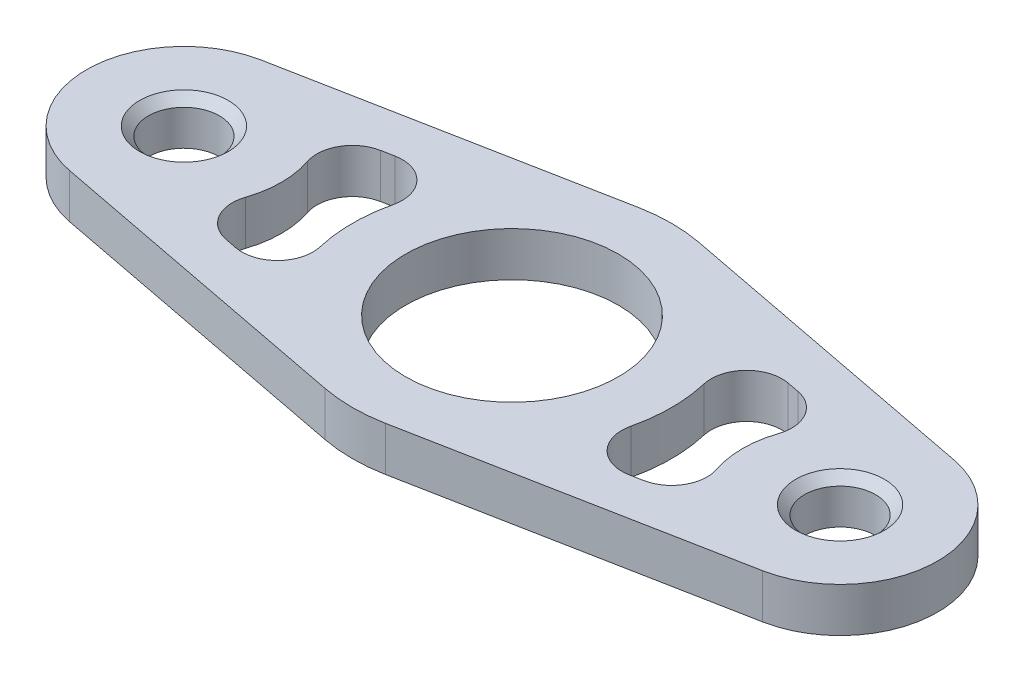
ISO-10303-21;
HEADER;
FILE_DESCRIPTION(('STEP AP214'),'2;1');
FILE_NAME('part.step','',(''),(''),'','','');
FILE_SCHEMA(('AUTOMOTIVE_DESIGN { 1 0 10303 214 1 1 1 1 }'));
ENDSEC;
DATA;
#1=APPLICATION_CONTEXT('core data for automotive mechanical design processes');
#2=APPLICATION_PROTOCOL_DEFINITION('international standard','automotive_design',2000,#1);
#3=PRODUCT_CONTEXT('',#1,'mechanical');
#4=PRODUCT('Part','Part','',(#3));
#5=PRODUCT_RELATED_PRODUCT_CATEGORY('part','',(#4));
#6=PRODUCT_DEFINITION_FORMATION('','',#4);
#7=PRODUCT_DEFINITION_CONTEXT('part definition',#1,'design');
#8=PRODUCT_DEFINITION('design','',#6,#7);
#9=PRODUCT_DEFINITION_SHAPE('','',#8);
#10=(LENGTH_UNIT() NAMED_UNIT(*) SI_UNIT(.MILLI.,.METRE.));
#11=(NAMED_UNIT(*) PLANE_ANGLE_UNIT() SI_UNIT($,.RADIAN.));
#12=(NAMED_UNIT(*) SI_UNIT($,.STERADIAN.) SOLID_ANGLE_UNIT());
#13=UNCERTAINTY_MEASURE_WITH_UNIT(LENGTH_MEASURE(1.E-05),#10,'distance_accuracy_value','');
#14=(GEOMETRIC_REPRESENTATION_CONTEXT(3) GLOBAL_UNCERTAINTY_ASSIGNED_CONTEXT((#13)) GLOBAL_UNIT_ASSIGNED_CONTEXT((#10,
#11,#12)) REPRESENTATION_CONTEXT('',''));
#15=CARTESIAN_POINT('',(0.,0.,0.));
#16=DIRECTION('',(0.,0.,1.));
#17=DIRECTION('',(1.,0.,0.));
#18=AXIS2_PLACEMENT_3D('',#15,#16,#17);
#19=CARTESIAN_POINT('',(3.40540540540541,2.5,-17.6749317968935));
#20=DIRECTION('',(-0.189189189189189,0.,0.98194065538297));
#21=DIRECTION('',(0.98194065538297,0.,0.189189189189189));
#22=AXIS2_PLACEMENT_3D('',#19,#20,#21);
#23=PLANE('',#22);
#24=DIRECTION('',(-0.98194065538297,0.,-0.189189189189189));
#25=VECTOR('',#24,1.);
#26=CARTESIAN_POINT('',(3.40540540540541,-2.5,-17.6749317968935));
#27=LINE('',#26,#25);
#28=CARTESIAN_POINT('',(39.0810810810811,-2.5,-10.8013472092127));
#29=VERTEX_POINT('',#28);
#30=CARTESIAN_POINT('',(3.40540540540541,-2.5,-17.6749317968935));
#31=VERTEX_POINT('',#30);
#32=EDGE_CURVE('E234',#29,#31,#27,.T.);
#33=ORIENTED_EDGE('',*,*,#32,.T.);
#34=DIRECTION('',(0.,-1.,0.));
#35=VECTOR('',#34,1.);
#36=CARTESIAN_POINT('',(3.40540540540541,2.5,-17.6749317968935));
#37=LINE('',#36,#35);
#38=CARTESIAN_POINT('',(3.40540540540541,2.5,-17.6749317968935));
#39=VERTEX_POINT('',#38);
#40=EDGE_CURVE('E213',#39,#31,#37,.T.);
#41=ORIENTED_EDGE('',*,*,#40,.F.);
#42=DIRECTION('',(-0.98194065538297,0.,-0.189189189189189));
#43=VECTOR('',#42,1.);
#44=CARTESIAN_POINT('',(3.40540540540541,2.5,-17.6749317968935));
#45=LINE('',#44,#43);
#46=CARTESIAN_POINT('',(39.0810810810811,2.5,-10.8013472092127));
#47=VERTEX_POINT('',#46);
#48=EDGE_CURVE('E221',#47,#39,#45,.T.);
#49=ORIENTED_EDGE('',*,*,#48,.F.);
#50=DIRECTION('',(0.,-1.,0.));
#51=VECTOR('',#50,1.);
#52=CARTESIAN_POINT('',(39.0810810810811,2.5,-10.8013472092127));
#53=LINE('',#52,#51);
#54=EDGE_CURVE('E448',#47,#29,#53,.T.);
#55=ORIENTED_EDGE('',*,*,#54,.T.);
#56=EDGE_LOOP('',(#33,#41,#49,#55));
#57=FACE_BOUND('',#56,.T.);
#58=ADVANCED_FACE('F43',(#57),#23,.F.);
#59=CARTESIAN_POINT('',(0.,2.5,0.));
#60=DIRECTION('',(0.,-1.,0.));
#61=DIRECTION('',(0.,0.,-1.));
#62=AXIS2_PLACEMENT_3D('',#59,#60,#61);
#63=CYLINDRICAL_SURFACE('',#62,18.);
#64=CARTESIAN_POINT('',(0.,-2.5,0.));
#65=DIRECTION('',(0.,1.,0.));
#66=DIRECTION('',(0.,0.,1.));
#67=AXIS2_PLACEMENT_3D('',#64,#65,#66);
#68=CIRCLE('',#67,18.);
#69=CARTESIAN_POINT('',(-3.40540540540541,-2.5,-17.6749317968935));
#70=VERTEX_POINT('',#69);
#71=EDGE_CURVE('E423',#31,#70,#68,.T.);
#72=ORIENTED_EDGE('',*,*,#71,.T.);
#73=DIRECTION('',(0.,-1.,0.));
#74=VECTOR('',#73,1.);
#75=CARTESIAN_POINT('',(-3.40540540540541,2.5,-17.6749317968935));
#76=LINE('',#75,#74);
#77=CARTESIAN_POINT('',(-3.40540540540541,2.5,-17.6749317968935));
#78=VERTEX_POINT('',#77);
#79=EDGE_CURVE('E215',#78,#70,#76,.T.);
#80=ORIENTED_EDGE('',*,*,#79,.F.);
#81=CARTESIAN_POINT('',(0.,2.5,0.));
#82=DIRECTION('',(0.,1.,0.));
#83=DIRECTION('',(0.,0.,1.));
#84=AXIS2_PLACEMENT_3D('',#81,#82,#83);
#85=CIRCLE('',#84,18.);
#86=EDGE_CURVE('E208',#39,#78,#85,.T.);
#87=ORIENTED_EDGE('',*,*,#86,.F.);
#88=ORIENTED_EDGE('',*,*,#40,.T.);
#89=EDGE_LOOP('',(#72,#80,#87,#88));
#90=FACE_BOUND('',#89,.T.);
#91=ADVANCED_FACE('F211',(#90),#63,.T.);
#92=CARTESIAN_POINT('',(-3.40540540540541,2.5,-17.6749317968935));
#93=DIRECTION('',(-0.189189189189189,0.,-0.98194065538297));
#94=DIRECTION('',(-0.98194065538297,0.,0.189189189189189));
#95=AXIS2_PLACEMENT_3D('',#92,#93,#94);
#96=PLANE('',#95);
#97=DIRECTION('',(0.98194065538297,0.,-0.189189189189189));
#98=VECTOR('',#97,1.);
#99=CARTESIAN_POINT('',(-3.40540540540541,-2.5,-17.6749317968935));
#100=LINE('',#99,#98);
#101=CARTESIAN_POINT('',(-39.0810810810811,-2.5,-10.8013472092127));
#102=VERTEX_POINT('',#101);
#103=EDGE_CURVE('E426',#102,#70,#100,.T.);
#104=ORIENTED_EDGE('',*,*,#103,.F.);
#105=DIRECTION('',(0.,-1.,0.));
#106=VECTOR('',#105,1.);
#107=CARTESIAN_POINT('',(-39.0810810810811,2.5,-10.8013472092127));
#108=LINE('',#107,#106);
#109=CARTESIAN_POINT('',(-39.0810810810811,2.5,-10.8013472092127));
#110=VERTEX_POINT('',#109);
#111=EDGE_CURVE('E242',#110,#102,#108,.T.);
#112=ORIENTED_EDGE('',*,*,#111,.F.);
#113=DIRECTION('',(0.98194065538297,0.,-0.189189189189189));
#114=VECTOR('',#113,1.);
#115=CARTESIAN_POINT('',(-3.40540540540541,2.5,-17.6749317968935));
#116=LINE('',#115,#114);
#117=EDGE_CURVE('E220',#110,#78,#116,.T.);
#118=ORIENTED_EDGE('',*,*,#117,.T.);
#119=ORIENTED_EDGE('',*,*,#79,.T.);
#120=EDGE_LOOP('',(#104,#112,#118,#119));
#121=FACE_BOUND('',#120,.T.);
#122=ADVANCED_FACE('F475',(#121),#96,.T.);
#123=CARTESIAN_POINT('',(-37.,2.5,0.));
#124=DIRECTION('',(0.,-1.,0.));
#125=DIRECTION('',(0.,0.,-1.));
#126=AXIS2_PLACEMENT_3D('',#123,#124,#125);
#127=CYLINDRICAL_SURFACE('',#126,11.);
#128=CARTESIAN_POINT('',(-37.,-2.5,0.));
#129=DIRECTION('',(0.,1.,0.));
#130=DIRECTION('',(0.,0.,1.));
#131=AXIS2_PLACEMENT_3D('',#128,#129,#130);
#132=CIRCLE('',#131,11.);
#133=CARTESIAN_POINT('',(-39.0810810810811,-2.5,10.8013472092127));
#134=VERTEX_POINT('',#133);
#135=EDGE_CURVE('E430',#102,#134,#132,.T.);
#136=ORIENTED_EDGE('',*,*,#135,.T.);
#137=DIRECTION('',(0.,-1.,0.));
#138=VECTOR('',#137,1.);
#139=CARTESIAN_POINT('',(-39.0810810810811,2.5,10.8013472092127));
#140=LINE('',#139,#138);
#141=CARTESIAN_POINT('',(-39.0810810810811,2.5,10.8013472092127));
#142=VERTEX_POINT('',#141);
#143=EDGE_CURVE('E461',#142,#134,#140,.T.);
#144=ORIENTED_EDGE('',*,*,#143,.F.);
#145=CARTESIAN_POINT('',(-37.,2.5,0.));
#146=DIRECTION('',(0.,1.,0.));
#147=DIRECTION('',(0.,0.,1.));
#148=AXIS2_PLACEMENT_3D('',#145,#146,#147);
#149=CIRCLE('',#148,11.);
#150=EDGE_CURVE('E470',#110,#142,#149,.T.);
#151=ORIENTED_EDGE('',*,*,#150,.F.);
#152=ORIENTED_EDGE('',*,*,#111,.T.);
#153=EDGE_LOOP('',(#136,#144,#151,#152));
#154=FACE_BOUND('',#153,.T.);
#155=ADVANCED_FACE('F468',(#154),#127,.T.);
#156=CARTESIAN_POINT('',(-3.4054054054054,2.5,17.6749317968935));
#157=DIRECTION('',(0.189189189189189,0.,-0.98194065538297));
#158=DIRECTION('',(-0.98194065538297,0.,-0.189189189189189));
#159=AXIS2_PLACEMENT_3D('',#156,#157,#158);
#160=PLANE('',#159);
#161=DIRECTION('',(0.98194065538297,0.,0.189189189189189));
#162=VECTOR('',#161,1.);
#163=CARTESIAN_POINT('',(-3.4054054054054,-2.5,17.6749317968935));
#164=LINE('',#163,#162);
#165=CARTESIAN_POINT('',(-3.4054054054054,-2.5,17.6749317968935));
#166=VERTEX_POINT('',#165);
#167=EDGE_CURVE('E433',#134,#166,#164,.T.);
#168=ORIENTED_EDGE('',*,*,#167,.T.);
#169=DIRECTION('',(0.,-1.,0.));
#170=VECTOR('',#169,1.);
#171=CARTESIAN_POINT('',(-3.4054054054054,2.5,17.6749317968935));
#172=LINE('',#171,#170);
#173=CARTESIAN_POINT('',(-3.4054054054054,2.5,17.6749317968935));
#174=VERTEX_POINT('',#173);
#175=EDGE_CURVE('E457',#174,#166,#172,.T.);
#176=ORIENTED_EDGE('',*,*,#175,.F.);
#177=DIRECTION('',(0.98194065538297,0.,0.189189189189189));
#178=VECTOR('',#177,1.);
#179=CARTESIAN_POINT('',(-3.4054054054054,2.5,17.6749317968935));
#180=LINE('',#179,#178);
#181=EDGE_CURVE('E491',#142,#174,#180,.T.);
#182=ORIENTED_EDGE('',*,*,#181,.F.);
#183=ORIENTED_EDGE('',*,*,#143,.T.);
#184=EDGE_LOOP('',(#168,#176,#182,#183));
#185=FACE_BOUND('',#184,.T.);
#186=ADVANCED_FACE('F490',(#185),#160,.F.);
#187=CARTESIAN_POINT('',(0.,2.5,0.));
#188=DIRECTION('',(0.,-1.,0.));
#189=DIRECTION('',(0.,0.,-1.));
#190=AXIS2_PLACEMENT_3D('',#187,#188,#189);
#191=CYLINDRICAL_SURFACE('',#190,18.);
#192=CARTESIAN_POINT('',(0.,-2.5,0.));
#193=DIRECTION('',(0.,1.,0.));
#194=DIRECTION('',(0.,0.,1.));
#195=AXIS2_PLACEMENT_3D('',#192,#193,#194);
#196=CIRCLE('',#195,18.);
#197=CARTESIAN_POINT('',(3.4054054054054,-2.5,17.6749317968935));
#198=VERTEX_POINT('',#197);
#199=EDGE_CURVE('E436',#166,#198,#196,.T.);
#200=ORIENTED_EDGE('',*,*,#199,.T.);
#201=DIRECTION('',(0.,-1.,0.));
#202=VECTOR('',#201,1.);
#203=CARTESIAN_POINT('',(3.4054054054054,2.5,17.6749317968935));
#204=LINE('',#203,#202);
#205=CARTESIAN_POINT('',(3.4054054054054,2.5,17.6749317968935));
#206=VERTEX_POINT('',#205);
#207=EDGE_CURVE('E454',#206,#198,#204,.T.);
#208=ORIENTED_EDGE('',*,*,#207,.F.);
#209=CARTESIAN_POINT('',(0.,2.5,0.));
#210=DIRECTION('',(0.,1.,0.));
#211=DIRECTION('',(0.,0.,1.));
#212=AXIS2_PLACEMENT_3D('',#209,#210,#211);
#213=CIRCLE('',#212,18.);
#214=EDGE_CURVE('E487',#174,#206,#213,.T.);
#215=ORIENTED_EDGE('',*,*,#214,.F.);
#216=ORIENTED_EDGE('',*,*,#175,.T.);
#217=EDGE_LOOP('',(#200,#208,#215,#216));
#218=FACE_BOUND('',#217,.T.);
#219=ADVANCED_FACE('F484',(#218),#191,.T.);
#220=CARTESIAN_POINT('',(3.4054054054054,2.5,17.6749317968935));
#221=DIRECTION('',(0.189189189189189,0.,0.98194065538297));
#222=DIRECTION('',(0.98194065538297,0.,-0.189189189189189));
#223=AXIS2_PLACEMENT_3D('',#220,#221,#222);
#224=PLANE('',#223);
#225=DIRECTION('',(-0.98194065538297,0.,0.189189189189189));
#226=VECTOR('',#225,1.);
#227=CARTESIAN_POINT('',(3.4054054054054,-2.5,17.6749317968935));
#228=LINE('',#227,#226);
#229=CARTESIAN_POINT('',(39.0810810810811,-2.5,10.8013472092127));
#230=VERTEX_POINT('',#229);
#231=EDGE_CURVE('E440',#230,#198,#228,.T.);
#232=ORIENTED_EDGE('',*,*,#231,.F.);
#233=DIRECTION('',(0.,-1.,0.));
#234=VECTOR('',#233,1.);
#235=CARTESIAN_POINT('',(39.0810810810811,2.5,10.8013472092127));
#236=LINE('',#235,#234);
#237=CARTESIAN_POINT('',(39.0810810810811,2.5,10.8013472092127));
#238=VERTEX_POINT('',#237);
#239=EDGE_CURVE('E451',#238,#230,#236,.T.);
#240=ORIENTED_EDGE('',*,*,#239,.F.);
#241=DIRECTION('',(-0.98194065538297,0.,0.189189189189189));
#242=VECTOR('',#241,1.);
#243=CARTESIAN_POINT('',(3.4054054054054,2.5,17.6749317968935));
#244=LINE('',#243,#242);
#245=EDGE_CURVE('E496',#238,#206,#244,.T.);
#246=ORIENTED_EDGE('',*,*,#245,.T.);
#247=ORIENTED_EDGE('',*,*,#207,.T.);
#248=EDGE_LOOP('',(#232,#240,#246,#247));
#249=FACE_BOUND('',#248,.T.);
#250=ADVANCED_FACE('F481',(#249),#224,.T.);
#251=CARTESIAN_POINT('',(0.,2.5,0.));
#252=DIRECTION('',(0.,-1.,0.));
#253=DIRECTION('',(0.,0.,-1.));
#254=AXIS2_PLACEMENT_3D('',#251,#252,#253);
#255=CYLINDRICAL_SURFACE('',#254,18.);
#256=CARTESIAN_POINT('',(0.,2.5,0.));
#257=DIRECTION('',(0.,1.,0.));
#258=DIRECTION('',(0.,0.,1.));
#259=AXIS2_PLACEMENT_3D('',#256,#257,#258);
#260=CIRCLE('',#259,18.);
#261=CARTESIAN_POINT('',(17.5213831005138,2.5,-4.12324317073715));
#262=VERTEX_POINT('',#261);
#263=CARTESIAN_POINT('',(17.5213831005138,2.5,4.12324317073716));
#264=VERTEX_POINT('',#263);
#265=EDGE_CURVE('E379',#262,#264,#260,.F.);
#266=ORIENTED_EDGE('',*,*,#265,.T.);
#267=DIRECTION('',(0.,-1.,0.));
#268=VECTOR('',#267,1.);
#269=CARTESIAN_POINT('',(17.5213831005138,2.5,4.12324317073716));
#270=LINE('',#269,#268);
#271=CARTESIAN_POINT('',(17.5213831005138,-2.5,4.12324317073716));
#272=VERTEX_POINT('',#271);
#273=EDGE_CURVE('E240',#264,#272,#270,.T.);
#274=ORIENTED_EDGE('',*,*,#273,.T.);
#275=CARTESIAN_POINT('',(0.,-2.5,0.));
#276=DIRECTION('',(0.,1.,0.));
#277=DIRECTION('',(0.,0.,1.));
#278=AXIS2_PLACEMENT_3D('',#275,#276,#277);
#279=CIRCLE('',#278,18.);
#280=CARTESIAN_POINT('',(17.5213831005138,-2.5,-4.12324317073715));
#281=VERTEX_POINT('',#280);
#282=EDGE_CURVE('E408',#281,#272,#279,.F.);
#283=ORIENTED_EDGE('',*,*,#282,.F.);
#284=DIRECTION('',(0.,-1.,0.));
#285=VECTOR('',#284,1.);
#286=CARTESIAN_POINT('',(17.5213831005138,2.5,-4.12324317073715));
#287=LINE('',#286,#285);
#288=EDGE_CURVE('E236',#281,#262,#287,.F.);
#289=ORIENTED_EDGE('',*,*,#288,.T.);
#290=EDGE_LOOP('',(#266,#274,#283,#289));
#291=FACE_BOUND('',#290,.T.);
#292=ADVANCED_FACE('F575',(#291),#255,.T.);
#293=CARTESIAN_POINT('',(2.45945945945945,2.5,-12.7652285199786));
#294=DIRECTION('',(-0.189189189189189,0.,0.98194065538297));
#295=DIRECTION('',(0.98194065538297,0.,0.189189189189189));
#296=AXIS2_PLACEMENT_3D('',#293,#294,#295);
#297=PLANE('',#296);
#298=DIRECTION('',(-0.98194065538297,0.,-0.189189189189189));
#299=VECTOR('',#298,1.);
#300=CARTESIAN_POINT('',(2.45945945945945,-2.5,-12.7652285199786));
#301=LINE('',#300,#299);
#302=CARTESIAN_POINT('',(23.5375378464249,-2.5,-8.70414342503374));
#303=VERTEX_POINT('',#302);
#304=CARTESIAN_POINT('',(22.1717805462736,-2.5,-8.96728205243284));
#305=VERTEX_POINT('',#304);
#306=EDGE_CURVE('E399',#303,#305,#301,.T.);
#307=ORIENTED_EDGE('',*,*,#306,.F.);
#308=DIRECTION('',(0.,1.,0.));
#309=VECTOR('',#308,1.);
#310=CARTESIAN_POINT('',(23.5375378464249,2.5,-8.70414342503374));
#311=LINE('',#310,#309);
#312=CARTESIAN_POINT('',(23.5375378464249,2.5,-8.70414342503374));
#313=VERTEX_POINT('',#312);
#314=EDGE_CURVE('E267',#303,#313,#311,.T.);
#315=ORIENTED_EDGE('',*,*,#314,.T.);
#316=DIRECTION('',(-0.98194065538297,0.,-0.189189189189189));
#317=VECTOR('',#316,1.);
#318=CARTESIAN_POINT('',(2.45945945945945,2.5,-12.7652285199786));
#319=LINE('',#318,#317);
#320=CARTESIAN_POINT('',(22.1717805462736,2.5,-8.96728205243284));
#321=VERTEX_POINT('',#320);
#322=EDGE_CURVE('E388',#313,#321,#319,.T.);
#323=ORIENTED_EDGE('',*,*,#322,.T.);
#324=DIRECTION('',(0.,1.,0.));
#325=VECTOR('',#324,1.);
#326=CARTESIAN_POINT('',(22.1717805462736,-2.5,-8.96728205243284));
#327=LINE('',#326,#325);
#328=EDGE_CURVE('E263',#321,#305,#327,.F.);
#329=ORIENTED_EDGE('',*,*,#328,.T.);
#330=EDGE_LOOP('',(#307,#315,#323,#329));
#331=FACE_BOUND('',#330,.T.);
#332=ADVANCED_FACE('F398',(#331),#297,.T.);
#333=CARTESIAN_POINT('',(37.,2.5,0.));
#334=DIRECTION('',(0.,-1.,0.));
#335=DIRECTION('',(0.,0.,-1.));
#336=AXIS2_PLACEMENT_3D('',#333,#334,#335);
#337=CYLINDRICAL_SURFACE('',#336,11.);
#338=CARTESIAN_POINT('',(37.,-2.5,0.));
#339=DIRECTION('',(0.,1.,0.));
#340=DIRECTION('',(0.,0.,1.));
#341=AXIS2_PLACEMENT_3D('',#338,#339,#340);
#342=CIRCLE('',#341,11.);
#343=CARTESIAN_POINT('',(26.57257279909,-2.5,3.50267925590137));
#344=VERTEX_POINT('',#343);
#345=CARTESIAN_POINT('',(26.57257279909,-2.5,-3.50267925590136));
#346=VERTEX_POINT('',#345);
#347=EDGE_CURVE('E407',#344,#346,#342,.F.);
#348=ORIENTED_EDGE('',*,*,#347,.F.);
#349=DIRECTION('',(0.,-1.,0.));
#350=VECTOR('',#349,1.);
#351=CARTESIAN_POINT('',(26.57257279909,2.5,3.50267925590137));
#352=LINE('',#351,#350);
#353=CARTESIAN_POINT('',(26.57257279909,2.5,3.50267925590137));
#354=VERTEX_POINT('',#353);
#355=EDGE_CURVE('E260',#344,#354,#352,.F.);
#356=ORIENTED_EDGE('',*,*,#355,.T.);
#357=CARTESIAN_POINT('',(37.,2.5,0.));
#358=DIRECTION('',(0.,1.,0.));
#359=DIRECTION('',(0.,0.,1.));
#360=AXIS2_PLACEMENT_3D('',#357,#358,#359);
#361=CIRCLE('',#360,11.);
#362=CARTESIAN_POINT('',(26.57257279909,2.5,-3.50267925590136));
#363=VERTEX_POINT('',#362);
#364=EDGE_CURVE('E561',#354,#363,#361,.F.);
#365=ORIENTED_EDGE('',*,*,#364,.T.);
#366=DIRECTION('',(0.,-1.,0.));
#367=VECTOR('',#366,1.);
#368=CARTESIAN_POINT('',(26.57257279909,2.5,-3.50267925590136));
#369=LINE('',#368,#367);
#370=EDGE_CURVE('E256',#363,#346,#369,.T.);
#371=ORIENTED_EDGE('',*,*,#370,.T.);
#372=EDGE_LOOP('',(#348,#356,#365,#371));
#373=FACE_BOUND('',#372,.T.);
#374=ADVANCED_FACE('F583',(#373),#337,.T.);
#375=CARTESIAN_POINT('',(-2.45945945945945,2.5,12.7652285199786));
#376=DIRECTION('',(0.189189189189189,0.,-0.98194065538297));
#377=DIRECTION('',(-0.98194065538297,0.,-0.189189189189189));
#378=AXIS2_PLACEMENT_3D('',#375,#376,#377);
#379=PLANE('',#378);
#380=DIRECTION('',(0.98194065538297,0.,0.189189189189189));
#381=VECTOR('',#380,1.);
#382=CARTESIAN_POINT('',(-2.45945945945945,2.5,12.7652285199786));
#383=LINE('',#382,#381);
#384=CARTESIAN_POINT('',(-23.5375378464249,2.5,8.70414342503375));
#385=VERTEX_POINT('',#384);
#386=CARTESIAN_POINT('',(-22.1717805462736,2.5,8.96728205243285));
#387=VERTEX_POINT('',#386);
#388=EDGE_CURVE('E376',#385,#387,#383,.T.);
#389=ORIENTED_EDGE('',*,*,#388,.T.);
#390=DIRECTION('',(0.,-1.,0.));
#391=VECTOR('',#390,1.);
#392=CARTESIAN_POINT('',(-22.1717805462736,2.5,8.96728205243285));
#393=LINE('',#392,#391);
#394=CARTESIAN_POINT('',(-22.1717805462736,-2.5,8.96728205243285));
#395=VERTEX_POINT('',#394);
#396=EDGE_CURVE('E273',#387,#395,#393,.T.);
#397=ORIENTED_EDGE('',*,*,#396,.T.);
#398=DIRECTION('',(0.98194065538297,0.,0.189189189189189));
#399=VECTOR('',#398,1.);
#400=CARTESIAN_POINT('',(-2.45945945945945,-2.5,12.7652285199786));
#401=LINE('',#400,#399);
#402=CARTESIAN_POINT('',(-23.5375378464249,-2.5,8.70414342503375));
#403=VERTEX_POINT('',#402);
#404=EDGE_CURVE('E517',#403,#395,#401,.T.);
#405=ORIENTED_EDGE('',*,*,#404,.F.);
#406=DIRECTION('',(0.,-1.,0.));
#407=VECTOR('',#406,1.);
#408=CARTESIAN_POINT('',(-23.5375378464249,2.5,8.70414342503375));
#409=LINE('',#408,#407);
#410=EDGE_CURVE('E270',#403,#385,#409,.F.);
#411=ORIENTED_EDGE('',*,*,#410,.T.);
#412=EDGE_LOOP('',(#389,#397,#405,#411));
#413=FACE_BOUND('',#412,.T.);
#414=ADVANCED_FACE('F542',(#413),#379,.T.);
#415=CARTESIAN_POINT('',(-37.,2.5,0.));
#416=DIRECTION('',(0.,-1.,0.));
#417=DIRECTION('',(0.,0.,-1.));
#418=AXIS2_PLACEMENT_3D('',#415,#416,#417);
#419=CYLINDRICAL_SURFACE('',#418,11.);
#420=CARTESIAN_POINT('',(-37.,2.5,0.));
#421=DIRECTION('',(0.,1.,0.));
#422=DIRECTION('',(0.,0.,1.));
#423=AXIS2_PLACEMENT_3D('',#420,#421,#422);
#424=CIRCLE('',#423,11.);
#425=CARTESIAN_POINT('',(-26.57257279909,2.5,3.50267925590137));
#426=VERTEX_POINT('',#425);
#427=CARTESIAN_POINT('',(-26.57257279909,2.5,-3.50267925590136));
#428=VERTEX_POINT('',#427);
#429=EDGE_CURVE('E546',#426,#428,#424,.T.);
#430=ORIENTED_EDGE('',*,*,#429,.F.);
#431=DIRECTION('',(0.,-1.,0.));
#432=VECTOR('',#431,1.);
#433=CARTESIAN_POINT('',(-26.57257279909,2.5,3.50267925590137));
#434=LINE('',#433,#432);
#435=CARTESIAN_POINT('',(-26.57257279909,-2.5,3.50267925590137));
#436=VERTEX_POINT('',#435);
#437=EDGE_CURVE('E293',#426,#436,#434,.T.);
#438=ORIENTED_EDGE('',*,*,#437,.T.);
#439=CARTESIAN_POINT('',(-37.,-2.5,0.));
#440=DIRECTION('',(0.,1.,0.));
#441=DIRECTION('',(0.,0.,1.));
#442=AXIS2_PLACEMENT_3D('',#439,#440,#441);
#443=CIRCLE('',#442,11.);
#444=CARTESIAN_POINT('',(-26.57257279909,-2.5,-3.50267925590136));
#445=VERTEX_POINT('',#444);
#446=EDGE_CURVE('E521',#436,#445,#443,.T.);
#447=ORIENTED_EDGE('',*,*,#446,.T.);
#448=DIRECTION('',(0.,-1.,0.));
#449=VECTOR('',#448,1.);
#450=CARTESIAN_POINT('',(-26.57257279909,2.5,-3.50267925590136));
#451=LINE('',#450,#449);
#452=EDGE_CURVE('E60',#445,#428,#451,.F.);
#453=ORIENTED_EDGE('',*,*,#452,.T.);
#454=EDGE_LOOP('',(#430,#438,#447,#453));
#455=FACE_BOUND('',#454,.T.);
#456=ADVANCED_FACE('F618',(#455),#419,.T.);
#457=CARTESIAN_POINT('',(-2.45945945945945,2.5,-12.7652285199786));
#458=DIRECTION('',(-0.189189189189189,0.,-0.98194065538297));
#459=DIRECTION('',(-0.98194065538297,0.,0.189189189189189));
#460=AXIS2_PLACEMENT_3D('',#457,#458,#459);
#461=PLANE('',#460);
#462=DIRECTION('',(0.98194065538297,0.,-0.189189189189189));
#463=VECTOR('',#462,1.);
#464=CARTESIAN_POINT('',(-2.45945945945945,-2.5,-12.7652285199786));
#465=LINE('',#464,#463);
#466=CARTESIAN_POINT('',(-23.5375378464249,-2.5,-8.70414342503374));
#467=VERTEX_POINT('',#466);
#468=CARTESIAN_POINT('',(-22.1717805462736,-2.5,-8.96728205243284));
#469=VERTEX_POINT('',#468);
#470=EDGE_CURVE('E524',#467,#469,#465,.T.);
#471=ORIENTED_EDGE('',*,*,#470,.T.);
#472=DIRECTION('',(0.,1.,0.));
#473=VECTOR('',#472,1.);
#474=CARTESIAN_POINT('',(-22.1717805462736,2.5,-8.96728205243284));
#475=LINE('',#474,#473);
#476=CARTESIAN_POINT('',(-22.1717805462736,2.5,-8.96728205243284));
#477=VERTEX_POINT('',#476);
#478=EDGE_CURVE('E288',#469,#477,#475,.T.);
#479=ORIENTED_EDGE('',*,*,#478,.T.);
#480=DIRECTION('',(0.98194065538297,0.,-0.189189189189189));
#481=VECTOR('',#480,1.);
#482=CARTESIAN_POINT('',(-2.45945945945945,2.5,-12.7652285199786));
#483=LINE('',#482,#481);
#484=CARTESIAN_POINT('',(-23.5375378464249,2.5,-8.70414342503374));
#485=VERTEX_POINT('',#484);
#486=EDGE_CURVE('E550',#485,#477,#483,.T.);
#487=ORIENTED_EDGE('',*,*,#486,.F.);
#488=DIRECTION('',(0.,1.,0.));
#489=VECTOR('',#488,1.);
#490=CARTESIAN_POINT('',(-23.5375378464249,-2.5,-8.70414342503374));
#491=LINE('',#490,#489);
#492=EDGE_CURVE('E284',#485,#467,#491,.F.);
#493=ORIENTED_EDGE('',*,*,#492,.T.);
#494=EDGE_LOOP('',(#471,#479,#487,#493));
#495=FACE_BOUND('',#494,.T.);
#496=ADVANCED_FACE('F606',(#495),#461,.F.);
#497=CARTESIAN_POINT('',(2.45945945945945,2.5,12.7652285199786));
#498=DIRECTION('',(0.189189189189189,0.,0.98194065538297));
#499=DIRECTION('',(0.98194065538297,0.,-0.189189189189189));
#500=AXIS2_PLACEMENT_3D('',#497,#498,#499);
#501=PLANE('',#500);
#502=DIRECTION('',(-0.98194065538297,0.,0.189189189189189));
#503=VECTOR('',#502,1.);
#504=CARTESIAN_POINT('',(2.45945945945945,-2.5,12.7652285199786));
#505=LINE('',#504,#503);
#506=CARTESIAN_POINT('',(23.5375378464249,-2.5,8.70414342503375));
#507=VERTEX_POINT('',#506);
#508=CARTESIAN_POINT('',(22.1717805462736,-2.5,8.96728205243285));
#509=VERTEX_POINT('',#508);
#510=EDGE_CURVE('E412',#507,#509,#505,.T.);
#511=ORIENTED_EDGE('',*,*,#510,.T.);
#512=DIRECTION('',(0.,-1.,0.));
#513=VECTOR('',#512,1.);
#514=CARTESIAN_POINT('',(22.1717805462736,2.5,8.96728205243285));
#515=LINE('',#514,#513);
#516=CARTESIAN_POINT('',(22.1717805462736,2.5,8.96728205243285));
#517=VERTEX_POINT('',#516);
#518=EDGE_CURVE('E253',#509,#517,#515,.F.);
#519=ORIENTED_EDGE('',*,*,#518,.T.);
#520=DIRECTION('',(-0.98194065538297,0.,0.189189189189189));
#521=VECTOR('',#520,1.);
#522=CARTESIAN_POINT('',(2.45945945945945,2.5,12.7652285199786));
#523=LINE('',#522,#521);
#524=CARTESIAN_POINT('',(23.5375378464249,2.5,8.70414342503375));
#525=VERTEX_POINT('',#524);
#526=EDGE_CURVE('E231',#525,#517,#523,.T.);
#527=ORIENTED_EDGE('',*,*,#526,.F.);
#528=DIRECTION('',(0.,-1.,0.));
#529=VECTOR('',#528,1.);
#530=CARTESIAN_POINT('',(23.5375378464249,2.5,8.70414342503375));
#531=LINE('',#530,#529);
#532=EDGE_CURVE('E249',#525,#507,#531,.T.);
#533=ORIENTED_EDGE('',*,*,#532,.T.);
#534=EDGE_LOOP('',(#511,#519,#527,#533));
#535=FACE_BOUND('',#534,.T.);
#536=ADVANCED_FACE('F577',(#535),#501,.F.);
#537=CARTESIAN_POINT('',(0.,2.5,0.));
#538=DIRECTION('',(0.,-1.,0.));
#539=DIRECTION('',(0.,0.,-1.));
#540=AXIS2_PLACEMENT_3D('',#537,#538,#539);
#541=CYLINDRICAL_SURFACE('',#540,18.);
#542=CARTESIAN_POINT('',(0.,-2.5,0.));
#543=DIRECTION('',(0.,1.,0.));
#544=DIRECTION('',(0.,0.,1.));
#545=AXIS2_PLACEMENT_3D('',#542,#543,#544);
#546=CIRCLE('',#545,18.);
#547=CARTESIAN_POINT('',(-17.5213831005138,-2.5,-4.12324317073715));
#548=VERTEX_POINT('',#547);
#549=CARTESIAN_POINT('',(-17.5213831005138,-2.5,4.12324317073716));
#550=VERTEX_POINT('',#549);
#551=EDGE_CURVE('E414',#548,#550,#546,.T.);
#552=ORIENTED_EDGE('',*,*,#551,.T.);
#553=DIRECTION('',(0.,-1.,0.));
#554=VECTOR('',#553,1.);
#555=CARTESIAN_POINT('',(-17.5213831005138,2.5,4.12324317073716));
#556=LINE('',#555,#554);
#557=CARTESIAN_POINT('',(-17.5213831005138,2.5,4.12324317073716));
#558=VERTEX_POINT('',#557);
#559=EDGE_CURVE('E281',#550,#558,#556,.F.);
#560=ORIENTED_EDGE('',*,*,#559,.T.);
#561=CARTESIAN_POINT('',(0.,2.5,0.));
#562=DIRECTION('',(0.,1.,0.));
#563=DIRECTION('',(0.,0.,1.));
#564=AXIS2_PLACEMENT_3D('',#561,#562,#563);
#565=CIRCLE('',#564,18.);
#566=CARTESIAN_POINT('',(-17.5213831005138,2.5,-4.12324317073715));
#567=VERTEX_POINT('',#566);
#568=EDGE_CURVE('E389',#567,#558,#565,.T.);
#569=ORIENTED_EDGE('',*,*,#568,.F.);
#570=DIRECTION('',(0.,-1.,0.));
#571=VECTOR('',#570,1.);
#572=CARTESIAN_POINT('',(-17.5213831005138,2.5,-4.12324317073715));
#573=LINE('',#572,#571);
#574=EDGE_CURVE('E277',#567,#548,#573,.T.);
#575=ORIENTED_EDGE('',*,*,#574,.T.);
#576=EDGE_LOOP('',(#552,#560,#569,#575));
#577=FACE_BOUND('',#576,.T.);
#578=ADVANCED_FACE('F532',(#577),#541,.T.);
#579=CARTESIAN_POINT('',(0.,2.5,0.));
#580=DIRECTION('',(0.,-1.,0.));
#581=DIRECTION('',(0.,0.,-1.));
#582=AXIS2_PLACEMENT_3D('',#579,#580,#581);
#583=CYLINDRICAL_SURFACE('',#582,12.);
#584=CARTESIAN_POINT('',(0.,2.5,0.));
#585=DIRECTION('',(0.,1.,0.));
#586=DIRECTION('',(0.,0.,1.));
#587=AXIS2_PLACEMENT_3D('',#584,#585,#586);
#588=CIRCLE('',#587,12.);
#589=CARTESIAN_POINT('',(0.,2.5,12.));
#590=VERTEX_POINT('',#589);
#591=EDGE_CURVE('E373',#590,#590,#588,.T.);
#592=ORIENTED_EDGE('',*,*,#591,.T.);
#593=EDGE_LOOP('',(#592));
#594=FACE_BOUND('',#593,.T.);
#595=CARTESIAN_POINT('',(0.,-2.5,0.));
#596=DIRECTION('',(0.,1.,0.));
#597=DIRECTION('',(0.,0.,1.));
#598=AXIS2_PLACEMENT_3D('',#595,#596,#597);
#599=CIRCLE('',#598,12.);
#600=CARTESIAN_POINT('',(0.,-2.5,12.));
#601=VERTEX_POINT('',#600);
#602=EDGE_CURVE('E513',#601,#601,#599,.T.);
#603=ORIENTED_EDGE('',*,*,#602,.F.);
#604=EDGE_LOOP('',(#603));
#605=FACE_BOUND('',#604,.T.);
#606=ADVANCED_FACE('F615',(#594,#605),#583,.F.);
#607=CARTESIAN_POINT('',(-37.,2.5,0.));
#608=DIRECTION('',(0.,-1.,0.));
#609=DIRECTION('',(0.,0.,-1.));
#610=AXIS2_PLACEMENT_3D('',#607,#608,#609);
#611=CYLINDRICAL_SURFACE('',#610,4.00000000000001);
#612=CARTESIAN_POINT('',(-37.,1.5,0.));
#613=DIRECTION('',(0.,1.,0.));
#614=DIRECTION('',(0.,0.,1.));
#615=AXIS2_PLACEMENT_3D('',#612,#613,#614);
#616=CIRCLE('',#615,4.00000000000001);
#617=CARTESIAN_POINT('',(-37.,1.5,4.00000000000001));
#618=VERTEX_POINT('',#617);
#619=EDGE_CURVE('E11',#618,#618,#616,.T.);
#620=ORIENTED_EDGE('',*,*,#619,.T.);
#621=EDGE_LOOP('',(#620));
#622=FACE_BOUND('',#621,.T.);
#623=CARTESIAN_POINT('',(-37.,-2.5,0.));
#624=DIRECTION('',(0.,1.,0.));
#625=DIRECTION('',(0.,0.,1.));
#626=AXIS2_PLACEMENT_3D('',#623,#624,#625);
#627=CIRCLE('',#626,4.00000000000001);
#628=CARTESIAN_POINT('',(-37.,-2.5,4.00000000000001));
#629=VERTEX_POINT('',#628);
#630=EDGE_CURVE('E509',#629,#629,#627,.T.);
#631=ORIENTED_EDGE('',*,*,#630,.F.);
#632=EDGE_LOOP('',(#631));
#633=FACE_BOUND('',#632,.T.);
#634=ADVANCED_FACE('F626',(#622,#633),#611,.F.);
#635=CARTESIAN_POINT('',(37.,2.5,0.));
#636=DIRECTION('',(0.,-1.,0.));
#637=DIRECTION('',(0.,0.,-1.));
#638=AXIS2_PLACEMENT_3D('',#635,#636,#637);
#639=CYLINDRICAL_SURFACE('',#638,4.00000000000001);
#640=CARTESIAN_POINT('',(37.,1.5,0.));
#641=DIRECTION('',(0.,1.,0.));
#642=DIRECTION('',(0.,0.,1.));
#643=AXIS2_PLACEMENT_3D('',#640,#641,#642);
#644=CIRCLE('',#643,4.00000000000001);
#645=CARTESIAN_POINT('',(37.,1.5,4.00000000000001));
#646=VERTEX_POINT('',#645);
#647=EDGE_CURVE('E53',#646,#646,#644,.T.);
#648=ORIENTED_EDGE('',*,*,#647,.T.);
#649=EDGE_LOOP('',(#648));
#650=FACE_BOUND('',#649,.T.);
#651=CARTESIAN_POINT('',(37.,-2.5,0.));
#652=DIRECTION('',(0.,1.,0.));
#653=DIRECTION('',(0.,0.,1.));
#654=AXIS2_PLACEMENT_3D('',#651,#652,#653);
#655=CIRCLE('',#654,4.00000000000001);
#656=CARTESIAN_POINT('',(37.,-2.5,4.00000000000001));
#657=VERTEX_POINT('',#656);
#658=EDGE_CURVE('E505',#657,#657,#655,.F.);
#659=ORIENTED_EDGE('',*,*,#658,.T.);
#660=EDGE_LOOP('',(#659));
#661=FACE_BOUND('',#660,.T.);
#662=ADVANCED_FACE('F355',(#650,#661),#639,.F.);
#663=CARTESIAN_POINT('',(37.,2.5,0.));
#664=DIRECTION('',(0.,-1.,0.));
#665=DIRECTION('',(0.,0.,-1.));
#666=AXIS2_PLACEMENT_3D('',#663,#664,#665);
#667=CYLINDRICAL_SURFACE('',#666,11.);
#668=CARTESIAN_POINT('',(37.,-2.5,0.));
#669=DIRECTION('',(0.,1.,0.));
#670=DIRECTION('',(0.,0.,1.));
#671=AXIS2_PLACEMENT_3D('',#668,#669,#670);
#672=CIRCLE('',#671,11.);
#673=EDGE_CURVE('E444',#29,#230,#672,.F.);
#674=ORIENTED_EDGE('',*,*,#673,.F.);
#675=ORIENTED_EDGE('',*,*,#54,.F.);
#676=CARTESIAN_POINT('',(37.,2.5,0.));
#677=DIRECTION('',(0.,1.,0.));
#678=DIRECTION('',(0.,0.,1.));
#679=AXIS2_PLACEMENT_3D('',#676,#677,#678);
#680=CIRCLE('',#679,11.);
#681=EDGE_CURVE('E228',#47,#238,#680,.F.);
#682=ORIENTED_EDGE('',*,*,#681,.T.);
#683=ORIENTED_EDGE('',*,*,#239,.T.);
#684=EDGE_LOOP('',(#674,#675,#682,#683));
#685=FACE_BOUND('',#684,.T.);
#686=ADVANCED_FACE('F367',(#685),#667,.T.);
#687=CARTESIAN_POINT('',(0.,2.5,0.));
#688=DIRECTION('',(0.,1.,0.));
#689=DIRECTION('',(0.,0.,1.));
#690=AXIS2_PLACEMENT_3D('',#687,#688,#689);
#691=PLANE('',#690);
#692=CARTESIAN_POINT('',(37.,2.5,0.));
#693=DIRECTION('',(0.,1.,0.));
#694=DIRECTION('',(0.,0.,1.));
#695=AXIS2_PLACEMENT_3D('',#692,#693,#694);
#696=CIRCLE('',#695,5.);
#697=CARTESIAN_POINT('',(37.,2.5,5.00000000000001));
#698=VERTEX_POINT('',#697);
#699=EDGE_CURVE('E348',#698,#698,#696,.F.);
#700=ORIENTED_EDGE('',*,*,#699,.T.);
#701=EDGE_LOOP('',(#700));
#702=FACE_BOUND('',#701,.T.);
#703=CARTESIAN_POINT('',(-37.,2.5,0.));
#704=DIRECTION('',(0.,1.,0.));
#705=DIRECTION('',(0.,0.,1.));
#706=AXIS2_PLACEMENT_3D('',#703,#704,#705);
#707=CIRCLE('',#706,5.);
#708=CARTESIAN_POINT('',(-37.,2.5,5.00000000000001));
#709=VERTEX_POINT('',#708);
#710=EDGE_CURVE('E344',#709,#709,#707,.F.);
#711=ORIENTED_EDGE('',*,*,#710,.T.);
#712=EDGE_LOOP('',(#711));
#713=FACE_BOUND('',#712,.T.);
#714=ORIENTED_EDGE('',*,*,#591,.F.);
#715=EDGE_LOOP('',(#714));
#716=FACE_BOUND('',#715,.T.);
#717=ORIENTED_EDGE('',*,*,#388,.F.);
#718=CARTESIAN_POINT('',(-22.7807810896682,2.5,4.77638080350187));
#719=DIRECTION('',(0.,1.,0.));
#720=DIRECTION('',(0.,0.,1.));
#721=AXIS2_PLACEMENT_3D('',#718,#719,#720);
#722=CIRCLE('',#721,4.);
#723=EDGE_CURVE('E67',#385,#426,#722,.F.);
#724=ORIENTED_EDGE('',*,*,#723,.T.);
#725=ORIENTED_EDGE('',*,*,#429,.T.);
#726=CARTESIAN_POINT('',(-22.7807810896682,2.5,-4.77638080350186));
#727=DIRECTION('',(0.,1.,0.));
#728=DIRECTION('',(0.,0.,1.));
#729=AXIS2_PLACEMENT_3D('',#726,#727,#728);
#730=CIRCLE('',#729,4.);
#731=EDGE_CURVE('E341',#428,#485,#730,.F.);
#732=ORIENTED_EDGE('',*,*,#731,.T.);
#733=ORIENTED_EDGE('',*,*,#486,.T.);
#734=CARTESIAN_POINT('',(-21.4150237895168,2.5,-5.03951943090096));
#735=DIRECTION('',(0.,1.,0.));
#736=DIRECTION('',(0.,0.,1.));
#737=AXIS2_PLACEMENT_3D('',#734,#735,#736);
#738=CIRCLE('',#737,4.);
#739=EDGE_CURVE('E330',#477,#567,#738,.F.);
#740=ORIENTED_EDGE('',*,*,#739,.T.);
#741=ORIENTED_EDGE('',*,*,#568,.T.);
#742=CARTESIAN_POINT('',(-21.4150237895168,2.5,5.03951943090097));
#743=DIRECTION('',(0.,1.,0.));
#744=DIRECTION('',(0.,0.,1.));
#745=AXIS2_PLACEMENT_3D('',#742,#743,#744);
#746=CIRCLE('',#745,4.);
#747=EDGE_CURVE('E324',#558,#387,#746,.F.);
#748=ORIENTED_EDGE('',*,*,#747,.T.);
#749=EDGE_LOOP('',(#717,#724,#725,#732,#733,#740,#741,#748));
#750=FACE_BOUND('',#749,.T.);
#751=ORIENTED_EDGE('',*,*,#265,.F.);
#752=CARTESIAN_POINT('',(21.4150237895168,2.5,-5.03951943090096));
#753=DIRECTION('',(0.,1.,0.));
#754=DIRECTION('',(0.,0.,1.));
#755=AXIS2_PLACEMENT_3D('',#752,#753,#754);
#756=CIRCLE('',#755,4.);
#757=EDGE_CURVE('E318',#262,#321,#756,.F.);
#758=ORIENTED_EDGE('',*,*,#757,.T.);
#759=ORIENTED_EDGE('',*,*,#322,.F.);
#760=CARTESIAN_POINT('',(22.7807810896682,2.5,-4.77638080350186));
#761=DIRECTION('',(0.,1.,0.));
#762=DIRECTION('',(0.,0.,1.));
#763=AXIS2_PLACEMENT_3D('',#760,#761,#762);
#764=CIRCLE('',#763,4.);
#765=EDGE_CURVE('E312',#313,#363,#764,.F.);
#766=ORIENTED_EDGE('',*,*,#765,.T.);
#767=ORIENTED_EDGE('',*,*,#364,.F.);
#768=CARTESIAN_POINT('',(22.7807810896682,2.5,4.77638080350187));
#769=DIRECTION('',(0.,1.,0.));
#770=DIRECTION('',(0.,0.,1.));
#771=AXIS2_PLACEMENT_3D('',#768,#769,#770);
#772=CIRCLE('',#771,4.);
#773=EDGE_CURVE('E306',#354,#525,#772,.F.);
#774=ORIENTED_EDGE('',*,*,#773,.T.);
#775=ORIENTED_EDGE('',*,*,#526,.T.);
#776=CARTESIAN_POINT('',(21.4150237895168,2.5,5.03951943090097));
#777=DIRECTION('',(0.,1.,0.));
#778=DIRECTION('',(0.,0.,1.));
#779=AXIS2_PLACEMENT_3D('',#776,#777,#778);
#780=CIRCLE('',#779,4.);
#781=EDGE_CURVE('E300',#517,#264,#780,.F.);
#782=ORIENTED_EDGE('',*,*,#781,.T.);
#783=EDGE_LOOP('',(#751,#758,#759,#766,#767,#774,#775,#782));
#784=FACE_BOUND('',#783,.T.);
#785=ORIENTED_EDGE('',*,*,#48,.T.);
#786=ORIENTED_EDGE('',*,*,#86,.T.);
#787=ORIENTED_EDGE('',*,*,#117,.F.);
#788=ORIENTED_EDGE('',*,*,#150,.T.);
#789=ORIENTED_EDGE('',*,*,#181,.T.);
#790=ORIENTED_EDGE('',*,*,#214,.T.);
#791=ORIENTED_EDGE('',*,*,#245,.F.);
#792=ORIENTED_EDGE('',*,*,#681,.F.);
#793=EDGE_LOOP('',(#785,#786,#787,#788,#789,#790,#791,#792));
#794=FACE_BOUND('',#793,.T.);
#795=ADVANCED_FACE('F225',(#702,#713,#716,#750,#784,#794),#691,.T.);
#796=CARTESIAN_POINT('',(0.,-2.5,0.));
#797=DIRECTION('',(0.,1.,0.));
#798=DIRECTION('',(0.,0.,1.));
#799=AXIS2_PLACEMENT_3D('',#796,#797,#798);
#800=PLANE('',#799);
#801=ORIENTED_EDGE('',*,*,#658,.F.);
#802=EDGE_LOOP('',(#801));
#803=FACE_BOUND('',#802,.T.);
#804=ORIENTED_EDGE('',*,*,#630,.T.);
#805=EDGE_LOOP('',(#804));
#806=FACE_BOUND('',#805,.T.);
#807=ORIENTED_EDGE('',*,*,#602,.T.);
#808=EDGE_LOOP('',(#807));
#809=FACE_BOUND('',#808,.T.);
#810=ORIENTED_EDGE('',*,*,#446,.F.);
#811=CARTESIAN_POINT('',(-22.7807810896682,-2.5,4.77638080350187));
#812=DIRECTION('',(0.,1.,0.));
#813=DIRECTION('',(0.,0.,1.));
#814=AXIS2_PLACEMENT_3D('',#811,#812,#813);
#815=CIRCLE('',#814,4.);
#816=EDGE_CURVE('E333',#436,#403,#815,.T.);
#817=ORIENTED_EDGE('',*,*,#816,.T.);
#818=ORIENTED_EDGE('',*,*,#404,.T.);
#819=CARTESIAN_POINT('',(-21.4150237895168,-2.5,5.03951943090097));
#820=DIRECTION('',(0.,1.,0.));
#821=DIRECTION('',(0.,0.,1.));
#822=AXIS2_PLACEMENT_3D('',#819,#820,#821);
#823=CIRCLE('',#822,4.);
#824=EDGE_CURVE('E321',#395,#550,#823,.T.);
#825=ORIENTED_EDGE('',*,*,#824,.T.);
#826=ORIENTED_EDGE('',*,*,#551,.F.);
#827=CARTESIAN_POINT('',(-21.4150237895168,-2.5,-5.03951943090096));
#828=DIRECTION('',(0.,1.,0.));
#829=DIRECTION('',(0.,0.,1.));
#830=AXIS2_PLACEMENT_3D('',#827,#828,#829);
#831=CIRCLE('',#830,4.);
#832=EDGE_CURVE('E327',#548,#469,#831,.T.);
#833=ORIENTED_EDGE('',*,*,#832,.T.);
#834=ORIENTED_EDGE('',*,*,#470,.F.);
#835=CARTESIAN_POINT('',(-22.7807810896682,-2.5,-4.77638080350186));
#836=DIRECTION('',(0.,1.,0.));
#837=DIRECTION('',(0.,0.,1.));
#838=AXIS2_PLACEMENT_3D('',#835,#836,#837);
#839=CIRCLE('',#838,4.);
#840=EDGE_CURVE('E338',#467,#445,#839,.T.);
#841=ORIENTED_EDGE('',*,*,#840,.T.);
#842=EDGE_LOOP('',(#810,#817,#818,#825,#826,#833,#834,#841));
#843=FACE_BOUND('',#842,.T.);
#844=ORIENTED_EDGE('',*,*,#306,.T.);
#845=CARTESIAN_POINT('',(21.4150237895168,-2.5,-5.03951943090096));
#846=DIRECTION('',(0.,1.,0.));
#847=DIRECTION('',(0.,0.,1.));
#848=AXIS2_PLACEMENT_3D('',#845,#846,#847);
#849=CIRCLE('',#848,4.);
#850=EDGE_CURVE('E315',#305,#281,#849,.T.);
#851=ORIENTED_EDGE('',*,*,#850,.T.);
#852=ORIENTED_EDGE('',*,*,#282,.T.);
#853=CARTESIAN_POINT('',(21.4150237895168,-2.5,5.03951943090097));
#854=DIRECTION('',(0.,1.,0.));
#855=DIRECTION('',(0.,0.,1.));
#856=AXIS2_PLACEMENT_3D('',#853,#854,#855);
#857=CIRCLE('',#856,4.);
#858=EDGE_CURVE('E297',#272,#509,#857,.T.);
#859=ORIENTED_EDGE('',*,*,#858,.T.);
#860=ORIENTED_EDGE('',*,*,#510,.F.);
#861=CARTESIAN_POINT('',(22.7807810896682,-2.5,4.77638080350187));
#862=DIRECTION('',(0.,1.,0.));
#863=DIRECTION('',(0.,0.,1.));
#864=AXIS2_PLACEMENT_3D('',#861,#862,#863);
#865=CIRCLE('',#864,4.);
#866=EDGE_CURVE('E303',#507,#344,#865,.T.);
#867=ORIENTED_EDGE('',*,*,#866,.T.);
#868=ORIENTED_EDGE('',*,*,#347,.T.);
#869=CARTESIAN_POINT('',(22.7807810896682,-2.5,-4.77638080350186));
#870=DIRECTION('',(0.,1.,0.));
#871=DIRECTION('',(0.,0.,1.));
#872=AXIS2_PLACEMENT_3D('',#869,#870,#871);
#873=CIRCLE('',#872,4.);
#874=EDGE_CURVE('E309',#346,#303,#873,.T.);
#875=ORIENTED_EDGE('',*,*,#874,.T.);
#876=EDGE_LOOP('',(#844,#851,#852,#859,#860,#867,#868,#875));
#877=FACE_BOUND('',#876,.T.);
#878=ORIENTED_EDGE('',*,*,#32,.F.);
#879=ORIENTED_EDGE('',*,*,#673,.T.);
#880=ORIENTED_EDGE('',*,*,#231,.T.);
#881=ORIENTED_EDGE('',*,*,#199,.F.);
#882=ORIENTED_EDGE('',*,*,#167,.F.);
#883=ORIENTED_EDGE('',*,*,#135,.F.);
#884=ORIENTED_EDGE('',*,*,#103,.T.);
#885=ORIENTED_EDGE('',*,*,#71,.F.);
#886=EDGE_LOOP('',(#878,#879,#880,#881,#882,#883,#884,#885));
#887=FACE_BOUND('',#886,.T.);
#888=ADVANCED_FACE('F366',(#803,#806,#809,#843,#877,#887),#800,.F.);
#889=CARTESIAN_POINT('',(21.4150237895168,2.5,5.03951943090097));
#890=DIRECTION('',(0.,-1.,0.));
#891=DIRECTION('',(0.,0.,-1.));
#892=AXIS2_PLACEMENT_3D('',#889,#890,#891);
#893=CYLINDRICAL_SURFACE('',#892,4.);
#894=ORIENTED_EDGE('',*,*,#781,.F.);
#895=ORIENTED_EDGE('',*,*,#518,.F.);
#896=ORIENTED_EDGE('',*,*,#858,.F.);
#897=ORIENTED_EDGE('',*,*,#273,.F.);
#898=EDGE_LOOP('',(#894,#895,#896,#897));
#899=FACE_BOUND('',#898,.T.);
#900=ADVANCED_FACE('F574',(#899),#893,.F.);
#901=CARTESIAN_POINT('',(22.7807810896682,2.5,4.77638080350187));
#902=DIRECTION('',(0.,-1.,0.));
#903=DIRECTION('',(0.,0.,-1.));
#904=AXIS2_PLACEMENT_3D('',#901,#902,#903);
#905=CYLINDRICAL_SURFACE('',#904,4.);
#906=ORIENTED_EDGE('',*,*,#773,.F.);
#907=ORIENTED_EDGE('',*,*,#355,.F.);
#908=ORIENTED_EDGE('',*,*,#866,.F.);
#909=ORIENTED_EDGE('',*,*,#532,.F.);
#910=EDGE_LOOP('',(#906,#907,#908,#909));
#911=FACE_BOUND('',#910,.T.);
#912=ADVANCED_FACE('F579',(#911),#905,.F.);
#913=CARTESIAN_POINT('',(22.7807810896682,2.5,-4.77638080350186));
#914=DIRECTION('',(0.,-1.,0.));
#915=DIRECTION('',(0.,0.,-1.));
#916=AXIS2_PLACEMENT_3D('',#913,#914,#915);
#917=CYLINDRICAL_SURFACE('',#916,4.);
#918=ORIENTED_EDGE('',*,*,#765,.F.);
#919=ORIENTED_EDGE('',*,*,#314,.F.);
#920=ORIENTED_EDGE('',*,*,#874,.F.);
#921=ORIENTED_EDGE('',*,*,#370,.F.);
#922=EDGE_LOOP('',(#918,#919,#920,#921));
#923=FACE_BOUND('',#922,.T.);
#924=ADVANCED_FACE('F587',(#923),#917,.F.);
#925=CARTESIAN_POINT('',(21.4150237895168,2.5,-5.03951943090096));
#926=DIRECTION('',(0.,-1.,0.));
#927=DIRECTION('',(0.,0.,-1.));
#928=AXIS2_PLACEMENT_3D('',#925,#926,#927);
#929=CYLINDRICAL_SURFACE('',#928,4.);
#930=ORIENTED_EDGE('',*,*,#757,.F.);
#931=ORIENTED_EDGE('',*,*,#288,.F.);
#932=ORIENTED_EDGE('',*,*,#850,.F.);
#933=ORIENTED_EDGE('',*,*,#328,.F.);
#934=EDGE_LOOP('',(#930,#931,#932,#933));
#935=FACE_BOUND('',#934,.T.);
#936=ADVANCED_FACE('F394',(#935),#929,.F.);
#937=CARTESIAN_POINT('',(-21.4150237895168,2.5,5.03951943090097));
#938=DIRECTION('',(0.,-1.,0.));
#939=DIRECTION('',(0.,0.,-1.));
#940=AXIS2_PLACEMENT_3D('',#937,#938,#939);
#941=CYLINDRICAL_SURFACE('',#940,4.);
#942=ORIENTED_EDGE('',*,*,#747,.F.);
#943=ORIENTED_EDGE('',*,*,#559,.F.);
#944=ORIENTED_EDGE('',*,*,#824,.F.);
#945=ORIENTED_EDGE('',*,*,#396,.F.);
#946=EDGE_LOOP('',(#942,#943,#944,#945));
#947=FACE_BOUND('',#946,.T.);
#948=ADVANCED_FACE('F539',(#947),#941,.F.);
#949=CARTESIAN_POINT('',(-21.4150237895168,2.5,-5.03951943090096));
#950=DIRECTION('',(0.,-1.,0.));
#951=DIRECTION('',(0.,0.,-1.));
#952=AXIS2_PLACEMENT_3D('',#949,#950,#951);
#953=CYLINDRICAL_SURFACE('',#952,4.);
#954=ORIENTED_EDGE('',*,*,#739,.F.);
#955=ORIENTED_EDGE('',*,*,#478,.F.);
#956=ORIENTED_EDGE('',*,*,#832,.F.);
#957=ORIENTED_EDGE('',*,*,#574,.F.);
#958=EDGE_LOOP('',(#954,#955,#956,#957));
#959=FACE_BOUND('',#958,.T.);
#960=ADVANCED_FACE('F764',(#959),#953,.F.);
#961=CARTESIAN_POINT('',(-22.7807810896682,2.5,4.77638080350187));
#962=DIRECTION('',(0.,-1.,0.));
#963=DIRECTION('',(0.,0.,-1.));
#964=AXIS2_PLACEMENT_3D('',#961,#962,#963);
#965=CYLINDRICAL_SURFACE('',#964,4.);
#966=ORIENTED_EDGE('',*,*,#723,.F.);
#967=ORIENTED_EDGE('',*,*,#410,.F.);
#968=ORIENTED_EDGE('',*,*,#816,.F.);
#969=ORIENTED_EDGE('',*,*,#437,.F.);
#970=EDGE_LOOP('',(#966,#967,#968,#969));
#971=FACE_BOUND('',#970,.T.);
#972=ADVANCED_FACE('F766',(#971),#965,.F.);
#973=CARTESIAN_POINT('',(-22.7807810896682,2.5,-4.77638080350186));
#974=DIRECTION('',(0.,-1.,0.));
#975=DIRECTION('',(0.,0.,-1.));
#976=AXIS2_PLACEMENT_3D('',#973,#974,#975);
#977=CYLINDRICAL_SURFACE('',#976,4.);
#978=ORIENTED_EDGE('',*,*,#731,.F.);
#979=ORIENTED_EDGE('',*,*,#452,.F.);
#980=ORIENTED_EDGE('',*,*,#840,.F.);
#981=ORIENTED_EDGE('',*,*,#492,.F.);
#982=EDGE_LOOP('',(#978,#979,#980,#981));
#983=FACE_BOUND('',#982,.T.);
#984=ADVANCED_FACE('F361',(#983),#977,.F.);
#985=CARTESIAN_POINT('',(37.,2.5,0.));
#986=DIRECTION('',(0.,1.,0.));
#987=DIRECTION('',(0.,0.,1.));
#988=AXIS2_PLACEMENT_3D('',#985,#986,#987);
#989=CONICAL_SURFACE('',#988,5.,0.785398163397448);
#990=ORIENTED_EDGE('',*,*,#647,.F.);
#991=EDGE_LOOP('',(#990));
#992=FACE_BOUND('',#991,.T.);
#993=ORIENTED_EDGE('',*,*,#699,.F.);
#994=EDGE_LOOP('',(#993));
#995=FACE_BOUND('',#994,.T.);
#996=ADVANCED_FACE('F358',(#992,#995),#989,.F.);
#997=CARTESIAN_POINT('',(-37.,1.5,0.));
#998=DIRECTION('',(0.,1.,0.));
#999=DIRECTION('',(0.,0.,1.));
#1000=AXIS2_PLACEMENT_3D('',#997,#998,#999);
#1001=CONICAL_SURFACE('',#1000,4.00000000000001,0.785398163397448);
#1002=ORIENTED_EDGE('',*,*,#710,.F.);
#1003=EDGE_LOOP('',(#1002));
#1004=FACE_BOUND('',#1003,.T.);
#1005=ORIENTED_EDGE('',*,*,#619,.F.);
#1006=EDGE_LOOP('',(#1005));
#1007=FACE_BOUND('',#1006,.T.);
#1008=ADVANCED_FACE('F46',(#1004,#1007),#1001,.F.);
#1009=CLOSED_SHELL('',(#58,#91,#122,#155,#186,#219,#250,#292,#332,#374,#414,#456,#496,#536,#578,
#606,#634,#662,#686,#795,#888,#900,#912,#924,#936,#948,#960,#972,#984,#996,#1008));
#1010=MANIFOLD_SOLID_BREP('B2',#1009);
#1011=ADVANCED_BREP_SHAPE_REPRESENTATION('',(#18,#1010),#14);
#1012=SHAPE_DEFINITION_REPRESENTATION(#9,#1011);
ENDSEC;
END-ISO-10303-21;
